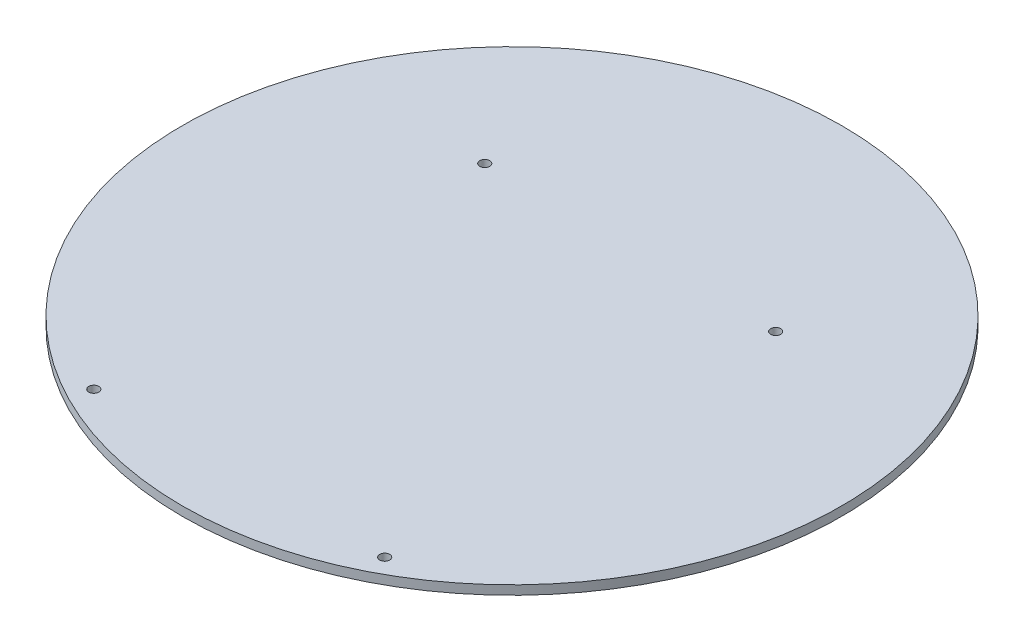
ISO-10303-21;
HEADER;
FILE_DESCRIPTION(('STEP AP214'),'2;1');
FILE_NAME('part.step','',(''),(''),'','','');
FILE_SCHEMA(('AUTOMOTIVE_DESIGN { 1 0 10303 214 1 1 1 1 }'));
ENDSEC;
DATA;
#1=APPLICATION_CONTEXT('core data for automotive mechanical design processes');
#2=APPLICATION_PROTOCOL_DEFINITION('international standard','automotive_design',2000,#1);
#3=PRODUCT_CONTEXT('',#1,'mechanical');
#4=PRODUCT('Part','Part','',(#3));
#5=PRODUCT_RELATED_PRODUCT_CATEGORY('part','',(#4));
#6=PRODUCT_DEFINITION_FORMATION('','',#4);
#7=PRODUCT_DEFINITION_CONTEXT('part definition',#1,'design');
#8=PRODUCT_DEFINITION('design','',#6,#7);
#9=PRODUCT_DEFINITION_SHAPE('','',#8);
#10=(LENGTH_UNIT() NAMED_UNIT(*) SI_UNIT(.MILLI.,.METRE.));
#11=(NAMED_UNIT(*) PLANE_ANGLE_UNIT() SI_UNIT($,.RADIAN.));
#12=(NAMED_UNIT(*) SI_UNIT($,.STERADIAN.) SOLID_ANGLE_UNIT());
#13=UNCERTAINTY_MEASURE_WITH_UNIT(LENGTH_MEASURE(1.E-05),#10,'distance_accuracy_value','');
#14=(GEOMETRIC_REPRESENTATION_CONTEXT(3) GLOBAL_UNCERTAINTY_ASSIGNED_CONTEXT((#13)) GLOBAL_UNIT_ASSIGNED_CONTEXT((#10,
#11,#12)) REPRESENTATION_CONTEXT('',''));
#15=CARTESIAN_POINT('',(0.,0.,0.));
#16=DIRECTION('',(0.,0.,1.));
#17=DIRECTION('',(1.,0.,0.));
#18=AXIS2_PLACEMENT_3D('',#15,#16,#17);
#19=CARTESIAN_POINT('',(0.,2.,0.));
#20=DIRECTION('',(0.,-1.,0.));
#21=DIRECTION('',(0.,0.,-1.));
#22=AXIS2_PLACEMENT_3D('',#19,#20,#21);
#23=CYLINDRICAL_SURFACE('',#22,72.5);
#24=CARTESIAN_POINT('',(0.,2.,0.));
#25=DIRECTION('',(0.,1.,0.));
#26=DIRECTION('',(0.,0.,1.));
#27=AXIS2_PLACEMENT_3D('',#24,#25,#26);
#28=CIRCLE('',#27,72.5);
#29=CARTESIAN_POINT('',(0.,2.,72.5));
#30=VERTEX_POINT('',#29);
#31=EDGE_CURVE('E10',#30,#30,#28,.T.);
#32=ORIENTED_EDGE('',*,*,#31,.F.);
#33=EDGE_LOOP('',(#32));
#34=FACE_BOUND('',#33,.T.);
#35=CARTESIAN_POINT('',(0.,0.,0.));
#36=DIRECTION('',(0.,1.,0.));
#37=DIRECTION('',(0.,0.,1.));
#38=AXIS2_PLACEMENT_3D('',#35,#36,#37);
#39=CIRCLE('',#38,72.5);
#40=CARTESIAN_POINT('',(0.,0.,72.5));
#41=VERTEX_POINT('',#40);
#42=EDGE_CURVE('E43',#41,#41,#39,.T.);
#43=ORIENTED_EDGE('',*,*,#42,.T.);
#44=EDGE_LOOP('',(#43));
#45=FACE_BOUND('',#44,.T.);
#46=ADVANCED_FACE('F36',(#34,#45),#23,.T.);
#47=CARTESIAN_POINT('',(0.,2.,0.));
#48=DIRECTION('',(0.,1.,0.));
#49=DIRECTION('',(0.,0.,1.));
#50=AXIS2_PLACEMENT_3D('',#47,#48,#49);
#51=PLANE('',#50);
#52=CARTESIAN_POINT('',(32.,2.,-26.));
#53=DIRECTION('',(0.,-1.,0.));
#54=DIRECTION('',(0.,0.,-1.));
#55=AXIS2_PLACEMENT_3D('',#52,#53,#54);
#56=CIRCLE('',#55,1.1);
#57=CARTESIAN_POINT('',(32.,2.,-27.1));
#58=VERTEX_POINT('',#57);
#59=EDGE_CURVE('E116',#58,#58,#56,.T.);
#60=ORIENTED_EDGE('',*,*,#59,.T.);
#61=EDGE_LOOP('',(#60));
#62=FACE_BOUND('',#61,.T.);
#63=CARTESIAN_POINT('',(-32.,2.,-26.));
#64=DIRECTION('',(0.,-1.,0.));
#65=DIRECTION('',(0.,0.,-1.));
#66=AXIS2_PLACEMENT_3D('',#63,#64,#65);
#67=CIRCLE('',#66,1.09999999999999);
#68=CARTESIAN_POINT('',(-32.,2.,-27.1));
#69=VERTEX_POINT('',#68);
#70=EDGE_CURVE('E111',#69,#69,#67,.T.);
#71=ORIENTED_EDGE('',*,*,#70,.T.);
#72=EDGE_LOOP('',(#71));
#73=FACE_BOUND('',#72,.T.);
#74=CARTESIAN_POINT('',(-32.,2.,60.));
#75=DIRECTION('',(0.,-1.,0.));
#76=DIRECTION('',(0.,0.,-1.));
#77=AXIS2_PLACEMENT_3D('',#74,#75,#76);
#78=CIRCLE('',#77,1.09999999999999);
#79=CARTESIAN_POINT('',(-32.,2.,58.9));
#80=VERTEX_POINT('',#79);
#81=EDGE_CURVE('E109',#80,#80,#78,.T.);
#82=ORIENTED_EDGE('',*,*,#81,.T.);
#83=EDGE_LOOP('',(#82));
#84=FACE_BOUND('',#83,.T.);
#85=CARTESIAN_POINT('',(32.,2.,60.));
#86=DIRECTION('',(0.,-1.,0.));
#87=DIRECTION('',(0.,0.,-1.));
#88=AXIS2_PLACEMENT_3D('',#85,#86,#87);
#89=CIRCLE('',#88,1.10000000000001);
#90=CARTESIAN_POINT('',(32.,2.,58.9));
#91=VERTEX_POINT('',#90);
#92=EDGE_CURVE('E50',#91,#91,#89,.T.);
#93=ORIENTED_EDGE('',*,*,#92,.T.);
#94=EDGE_LOOP('',(#93));
#95=FACE_BOUND('',#94,.T.);
#96=ORIENTED_EDGE('',*,*,#31,.T.);
#97=EDGE_LOOP('',(#96));
#98=FACE_BOUND('',#97,.T.);
#99=ADVANCED_FACE('F81',(#62,#73,#84,#95,#98),#51,.T.);
#100=CARTESIAN_POINT('',(0.,0.,0.));
#101=DIRECTION('',(0.,1.,0.));
#102=DIRECTION('',(0.,0.,1.));
#103=AXIS2_PLACEMENT_3D('',#100,#101,#102);
#104=PLANE('',#103);
#105=CARTESIAN_POINT('',(32.,0.,-26.));
#106=DIRECTION('',(0.,1.,0.));
#107=DIRECTION('',(0.,0.,1.));
#108=AXIS2_PLACEMENT_3D('',#105,#106,#107);
#109=CIRCLE('',#108,1.1);
#110=CARTESIAN_POINT('',(32.,0.,-24.9));
#111=VERTEX_POINT('',#110);
#112=EDGE_CURVE('E39',#111,#111,#109,.T.);
#113=ORIENTED_EDGE('',*,*,#112,.T.);
#114=EDGE_LOOP('',(#113));
#115=FACE_BOUND('',#114,.T.);
#116=CARTESIAN_POINT('',(-32.,0.,-26.));
#117=DIRECTION('',(0.,1.,0.));
#118=DIRECTION('',(0.,0.,1.));
#119=AXIS2_PLACEMENT_3D('',#116,#117,#118);
#120=CIRCLE('',#119,1.09999999999999);
#121=CARTESIAN_POINT('',(-32.,0.,-24.9));
#122=VERTEX_POINT('',#121);
#123=EDGE_CURVE('E58',#122,#122,#120,.T.);
#124=ORIENTED_EDGE('',*,*,#123,.T.);
#125=EDGE_LOOP('',(#124));
#126=FACE_BOUND('',#125,.T.);
#127=CARTESIAN_POINT('',(-32.,0.,60.));
#128=DIRECTION('',(0.,1.,0.));
#129=DIRECTION('',(0.,0.,1.));
#130=AXIS2_PLACEMENT_3D('',#127,#128,#129);
#131=CIRCLE('',#130,1.09999999999999);
#132=CARTESIAN_POINT('',(-32.,0.,61.1));
#133=VERTEX_POINT('',#132);
#134=EDGE_CURVE('E56',#133,#133,#131,.T.);
#135=ORIENTED_EDGE('',*,*,#134,.T.);
#136=EDGE_LOOP('',(#135));
#137=FACE_BOUND('',#136,.T.);
#138=CARTESIAN_POINT('',(32.,0.,60.));
#139=DIRECTION('',(0.,1.,0.));
#140=DIRECTION('',(0.,0.,1.));
#141=AXIS2_PLACEMENT_3D('',#138,#139,#140);
#142=CIRCLE('',#141,1.10000000000001);
#143=CARTESIAN_POINT('',(32.,0.,61.1));
#144=VERTEX_POINT('',#143);
#145=EDGE_CURVE('E53',#144,#144,#142,.T.);
#146=ORIENTED_EDGE('',*,*,#145,.T.);
#147=EDGE_LOOP('',(#146));
#148=FACE_BOUND('',#147,.T.);
#149=ORIENTED_EDGE('',*,*,#42,.F.);
#150=EDGE_LOOP('',(#149));
#151=FACE_BOUND('',#150,.T.);
#152=ADVANCED_FACE('F65',(#115,#126,#137,#148,#151),#104,.F.);
#153=CARTESIAN_POINT('',(32.,2.,60.));
#154=DIRECTION('',(0.,-1.,0.));
#155=DIRECTION('',(0.,0.,-1.));
#156=AXIS2_PLACEMENT_3D('',#153,#154,#155);
#157=CYLINDRICAL_SURFACE('',#156,1.10000000000001);
#158=ORIENTED_EDGE('',*,*,#92,.F.);
#159=EDGE_LOOP('',(#158));
#160=FACE_BOUND('',#159,.T.);
#161=ORIENTED_EDGE('',*,*,#145,.F.);
#162=EDGE_LOOP('',(#161));
#163=FACE_BOUND('',#162,.T.);
#164=ADVANCED_FACE('F93',(#160,#163),#157,.F.);
#165=CARTESIAN_POINT('',(-32.,2.,60.));
#166=DIRECTION('',(0.,-1.,0.));
#167=DIRECTION('',(0.,0.,-1.));
#168=AXIS2_PLACEMENT_3D('',#165,#166,#167);
#169=CYLINDRICAL_SURFACE('',#168,1.09999999999999);
#170=ORIENTED_EDGE('',*,*,#81,.F.);
#171=EDGE_LOOP('',(#170));
#172=FACE_BOUND('',#171,.T.);
#173=ORIENTED_EDGE('',*,*,#134,.F.);
#174=EDGE_LOOP('',(#173));
#175=FACE_BOUND('',#174,.T.);
#176=ADVANCED_FACE('F75',(#172,#175),#169,.F.);
#177=CARTESIAN_POINT('',(-32.,2.,-26.));
#178=DIRECTION('',(0.,-1.,0.));
#179=DIRECTION('',(0.,0.,-1.));
#180=AXIS2_PLACEMENT_3D('',#177,#178,#179);
#181=CYLINDRICAL_SURFACE('',#180,1.09999999999999);
#182=ORIENTED_EDGE('',*,*,#70,.F.);
#183=EDGE_LOOP('',(#182));
#184=FACE_BOUND('',#183,.T.);
#185=ORIENTED_EDGE('',*,*,#123,.F.);
#186=EDGE_LOOP('',(#185));
#187=FACE_BOUND('',#186,.T.);
#188=ADVANCED_FACE('F69',(#184,#187),#181,.F.);
#189=CARTESIAN_POINT('',(32.,2.,-26.));
#190=DIRECTION('',(0.,-1.,0.));
#191=DIRECTION('',(0.,0.,-1.));
#192=AXIS2_PLACEMENT_3D('',#189,#190,#191);
#193=CYLINDRICAL_SURFACE('',#192,1.1);
#194=ORIENTED_EDGE('',*,*,#59,.F.);
#195=EDGE_LOOP('',(#194));
#196=FACE_BOUND('',#195,.T.);
#197=ORIENTED_EDGE('',*,*,#112,.F.);
#198=EDGE_LOOP('',(#197));
#199=FACE_BOUND('',#198,.T.);
#200=ADVANCED_FACE('F67',(#196,#199),#193,.F.);
#201=CLOSED_SHELL('',(#46,#99,#152,#164,#176,#188,#200));
#202=MANIFOLD_SOLID_BREP('B2',#201);
#203=ADVANCED_BREP_SHAPE_REPRESENTATION('',(#18,#202),#14);
#204=SHAPE_DEFINITION_REPRESENTATION(#9,#203);
ENDSEC;
END-ISO-10303-21;
